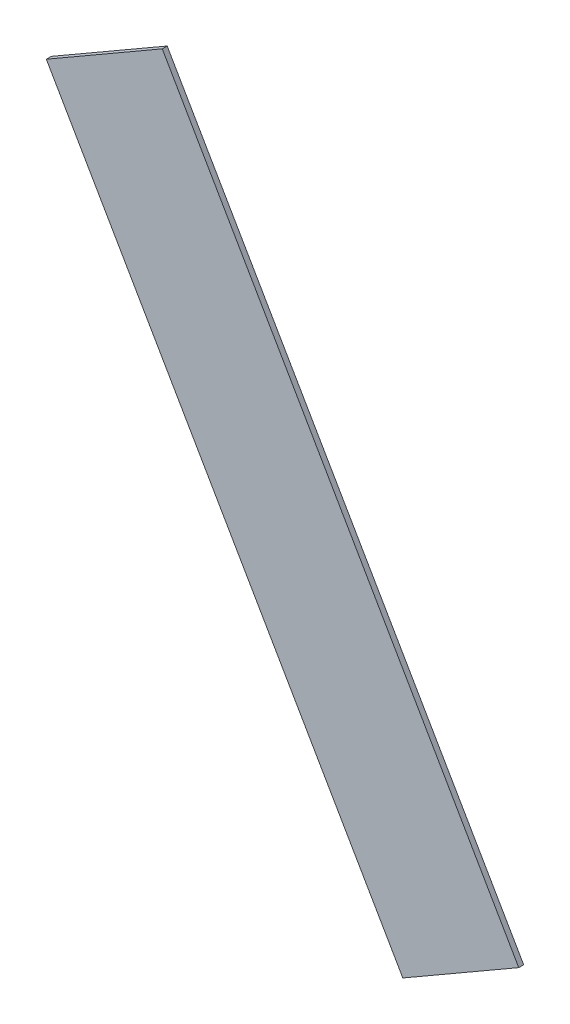
ISO-10303-21;
HEADER;
FILE_DESCRIPTION(('STEP AP214'),'2;1');
FILE_NAME('part.step','',(''),(''),'','','');
FILE_SCHEMA(('AUTOMOTIVE_DESIGN { 1 0 10303 214 1 1 1 1 }'));
ENDSEC;
DATA;
#1=APPLICATION_CONTEXT('core data for automotive mechanical design processes');
#2=APPLICATION_PROTOCOL_DEFINITION('international standard','automotive_design',2000,#1);
#3=PRODUCT_CONTEXT('',#1,'mechanical');
#4=PRODUCT('Part','Part','',(#3));
#5=PRODUCT_RELATED_PRODUCT_CATEGORY('part','',(#4));
#6=PRODUCT_DEFINITION_FORMATION('','',#4);
#7=PRODUCT_DEFINITION_CONTEXT('part definition',#1,'design');
#8=PRODUCT_DEFINITION('design','',#6,#7);
#9=PRODUCT_DEFINITION_SHAPE('','',#8);
#10=(LENGTH_UNIT() NAMED_UNIT(*) SI_UNIT(.MILLI.,.METRE.));
#11=(NAMED_UNIT(*) PLANE_ANGLE_UNIT() SI_UNIT($,.RADIAN.));
#12=(NAMED_UNIT(*) SI_UNIT($,.STERADIAN.) SOLID_ANGLE_UNIT());
#13=UNCERTAINTY_MEASURE_WITH_UNIT(LENGTH_MEASURE(1.E-05),#10,'distance_accuracy_value','');
#14=(GEOMETRIC_REPRESENTATION_CONTEXT(3) GLOBAL_UNCERTAINTY_ASSIGNED_CONTEXT((#13)) GLOBAL_UNIT_ASSIGNED_CONTEXT((#10,
#11,#12)) REPRESENTATION_CONTEXT('',''));
#15=CARTESIAN_POINT('',(0.,0.,0.));
#16=DIRECTION('',(0.,0.,1.));
#17=DIRECTION('',(1.,0.,0.));
#18=AXIS2_PLACEMENT_3D('',#15,#16,#17);
#19=CARTESIAN_POINT('',(0.,0.,1.635));
#20=DIRECTION('',(0.,0.,1.));
#21=DIRECTION('',(1.,0.,0.));
#22=AXIS2_PLACEMENT_3D('',#19,#20,#21);
#23=PLANE('',#22);
#24=DIRECTION('',(0.500000046480085,-0.866025376949147,0.));
#25=VECTOR('',#24,1.);
#26=CARTESIAN_POINT('',(-8.213638,-1.821456,1.635));
#27=LINE('',#26,#25);
#28=CARTESIAN_POINT('',(-8.213638,-1.821456,1.635));
#29=VERTEX_POINT('',#28);
#30=CARTESIAN_POINT('',(-5.683638,-6.203544,1.635));
#31=VERTEX_POINT('',#30);
#32=EDGE_CURVE('E20',#29,#31,#27,.T.);
#33=ORIENTED_EDGE('',*,*,#32,.F.);
#34=DIRECTION('',(0.866025368627884,0.500000060892933,0.));
#35=VECTOR('',#34,1.);
#36=CARTESIAN_POINT('',(-9.036362,-2.296456,1.635));
#37=LINE('',#36,#35);
#38=CARTESIAN_POINT('',(-9.036362,-2.296456,1.635));
#39=VERTEX_POINT('',#38);
#40=EDGE_CURVE('E107',#39,#29,#37,.T.);
#41=ORIENTED_EDGE('',*,*,#40,.F.);
#42=DIRECTION('',(-0.500000046480085,0.866025376949147,0.));
#43=VECTOR('',#42,1.);
#44=CARTESIAN_POINT('',(-6.506362,-6.678544,1.635));
#45=LINE('',#44,#43);
#46=CARTESIAN_POINT('',(-6.506362,-6.678544,1.635));
#47=VERTEX_POINT('',#46);
#48=EDGE_CURVE('E84',#47,#39,#45,.T.);
#49=ORIENTED_EDGE('',*,*,#48,.F.);
#50=DIRECTION('',(-0.866025368627884,-0.500000060892933,0.));
#51=VECTOR('',#50,1.);
#52=CARTESIAN_POINT('',(-5.683638,-6.203544,1.635));
#53=LINE('',#52,#51);
#54=EDGE_CURVE('E88',#31,#47,#53,.T.);
#55=ORIENTED_EDGE('',*,*,#54,.F.);
#56=EDGE_LOOP('',(#33,#41,#49,#55));
#57=FACE_BOUND('',#56,.T.);
#58=ADVANCED_FACE('F17',(#57),#23,.T.);
#59=CARTESIAN_POINT('',(0.,0.,1.6));
#60=DIRECTION('',(0.,0.,1.));
#61=DIRECTION('',(1.,0.,0.));
#62=AXIS2_PLACEMENT_3D('',#59,#60,#61);
#63=PLANE('',#62);
#64=DIRECTION('',(-0.866025368627884,-0.500000060892933,0.));
#65=VECTOR('',#64,1.);
#66=CARTESIAN_POINT('',(-5.683638,-6.203544,1.6));
#67=LINE('',#66,#65);
#68=CARTESIAN_POINT('',(-5.683638,-6.203544,1.6));
#69=VERTEX_POINT('',#68);
#70=CARTESIAN_POINT('',(-6.506362,-6.678544,1.6));
#71=VERTEX_POINT('',#70);
#72=EDGE_CURVE('E72',#69,#71,#67,.T.);
#73=ORIENTED_EDGE('',*,*,#72,.T.);
#74=DIRECTION('',(-0.500000046480085,0.866025376949147,0.));
#75=VECTOR('',#74,1.);
#76=CARTESIAN_POINT('',(-6.506362,-6.678544,1.6));
#77=LINE('',#76,#75);
#78=CARTESIAN_POINT('',(-9.036362,-2.296456,1.6));
#79=VERTEX_POINT('',#78);
#80=EDGE_CURVE('E96',#71,#79,#77,.T.);
#81=ORIENTED_EDGE('',*,*,#80,.T.);
#82=DIRECTION('',(0.866025368627884,0.500000060892933,0.));
#83=VECTOR('',#82,1.);
#84=CARTESIAN_POINT('',(-9.036362,-2.296456,1.6));
#85=LINE('',#84,#83);
#86=CARTESIAN_POINT('',(-8.213638,-1.821456,1.6));
#87=VERTEX_POINT('',#86);
#88=EDGE_CURVE('E74',#79,#87,#85,.T.);
#89=ORIENTED_EDGE('',*,*,#88,.T.);
#90=DIRECTION('',(0.500000046480085,-0.866025376949147,0.));
#91=VECTOR('',#90,1.);
#92=CARTESIAN_POINT('',(-8.213638,-1.821456,1.6));
#93=LINE('',#92,#91);
#94=EDGE_CURVE('E11',#87,#69,#93,.T.);
#95=ORIENTED_EDGE('',*,*,#94,.T.);
#96=EDGE_LOOP('',(#73,#81,#89,#95));
#97=FACE_BOUND('',#96,.T.);
#98=ADVANCED_FACE('F70',(#97),#63,.F.);
#99=CARTESIAN_POINT('',(-8.213638,-1.821456,1.6));
#100=DIRECTION('',(0.866025376949147,0.500000046480085,0.));
#101=DIRECTION('',(0.,0.,-1.));
#102=AXIS2_PLACEMENT_3D('',#99,#100,#101);
#103=PLANE('',#102);
#104=DIRECTION('',(0.,0.,1.));
#105=VECTOR('',#104,1.);
#106=CARTESIAN_POINT('',(-8.213638,-1.821456,1.6));
#107=LINE('',#106,#105);
#108=EDGE_CURVE('E111',#87,#29,#107,.T.);
#109=ORIENTED_EDGE('',*,*,#108,.T.);
#110=ORIENTED_EDGE('',*,*,#32,.T.);
#111=DIRECTION('',(0.,0.,1.));
#112=VECTOR('',#111,1.);
#113=CARTESIAN_POINT('',(-5.683638,-6.203544,1.6));
#114=LINE('',#113,#112);
#115=EDGE_CURVE('E80',#69,#31,#114,.T.);
#116=ORIENTED_EDGE('',*,*,#115,.F.);
#117=ORIENTED_EDGE('',*,*,#94,.F.);
#118=EDGE_LOOP('',(#109,#110,#116,#117));
#119=FACE_BOUND('',#118,.T.);
#120=ADVANCED_FACE('F86',(#119),#103,.T.);
#121=CARTESIAN_POINT('',(-9.036362,-2.296456,1.6));
#122=DIRECTION('',(-0.500000060892933,0.866025368627884,0.));
#123=DIRECTION('',(0.,0.,1.));
#124=AXIS2_PLACEMENT_3D('',#121,#122,#123);
#125=PLANE('',#124);
#126=DIRECTION('',(0.,0.,1.));
#127=VECTOR('',#126,1.);
#128=CARTESIAN_POINT('',(-9.036362,-2.296456,1.6));
#129=LINE('',#128,#127);
#130=EDGE_CURVE('E102',#79,#39,#129,.T.);
#131=ORIENTED_EDGE('',*,*,#130,.T.);
#132=ORIENTED_EDGE('',*,*,#40,.T.);
#133=ORIENTED_EDGE('',*,*,#108,.F.);
#134=ORIENTED_EDGE('',*,*,#88,.F.);
#135=EDGE_LOOP('',(#131,#132,#133,#134));
#136=FACE_BOUND('',#135,.T.);
#137=ADVANCED_FACE('F143',(#136),#125,.T.);
#138=CARTESIAN_POINT('',(-6.506362,-6.678544,1.6));
#139=DIRECTION('',(-0.866025376949147,-0.500000046480085,0.));
#140=DIRECTION('',(-0.500000046480085,0.866025376949147,0.));
#141=AXIS2_PLACEMENT_3D('',#138,#139,#140);
#142=PLANE('',#141);
#143=DIRECTION('',(0.,0.,1.));
#144=VECTOR('',#143,1.);
#145=CARTESIAN_POINT('',(-6.506362,-6.678544,1.6));
#146=LINE('',#145,#144);
#147=EDGE_CURVE('E82',#71,#47,#146,.T.);
#148=ORIENTED_EDGE('',*,*,#147,.T.);
#149=ORIENTED_EDGE('',*,*,#48,.T.);
#150=ORIENTED_EDGE('',*,*,#130,.F.);
#151=ORIENTED_EDGE('',*,*,#80,.F.);
#152=EDGE_LOOP('',(#148,#149,#150,#151));
#153=FACE_BOUND('',#152,.T.);
#154=ADVANCED_FACE('F132',(#153),#142,.T.);
#155=CARTESIAN_POINT('',(-5.683638,-6.203544,1.6));
#156=DIRECTION('',(0.500000060892933,-0.866025368627884,0.));
#157=DIRECTION('',(0.,0.,-1.));
#158=AXIS2_PLACEMENT_3D('',#155,#156,#157);
#159=PLANE('',#158);
#160=ORIENTED_EDGE('',*,*,#115,.T.);
#161=ORIENTED_EDGE('',*,*,#54,.T.);
#162=ORIENTED_EDGE('',*,*,#147,.F.);
#163=ORIENTED_EDGE('',*,*,#72,.F.);
#164=EDGE_LOOP('',(#160,#161,#162,#163));
#165=FACE_BOUND('',#164,.T.);
#166=ADVANCED_FACE('F78',(#165),#159,.T.);
#167=CLOSED_SHELL('',(#58,#98,#120,#137,#154,#166));
#168=MANIFOLD_SOLID_BREP('B1',#167);
#169=ADVANCED_BREP_SHAPE_REPRESENTATION('',(#18,#168),#14);
#170=SHAPE_DEFINITION_REPRESENTATION(#9,#169);
ENDSEC;
END-ISO-10303-21;
